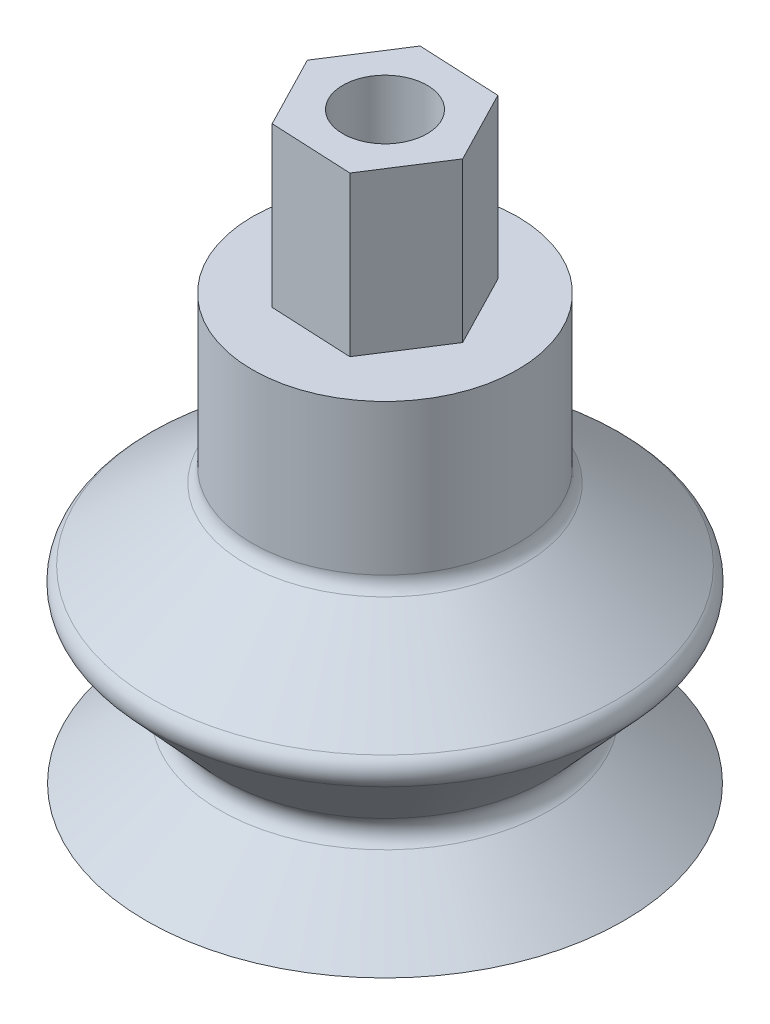
ISO-10303-21;
HEADER;
FILE_DESCRIPTION(('STEP AP214'),'2;1');
FILE_NAME('part.step','',(''),(''),'','','');
FILE_SCHEMA(('AUTOMOTIVE_DESIGN { 1 0 10303 214 1 1 1 1 }'));
ENDSEC;
DATA;
#1=APPLICATION_CONTEXT('core data for automotive mechanical design processes');
#2=APPLICATION_PROTOCOL_DEFINITION('international standard','automotive_design',2000,#1);
#3=PRODUCT_CONTEXT('',#1,'mechanical');
#4=PRODUCT('Part','Part','',(#3));
#5=PRODUCT_RELATED_PRODUCT_CATEGORY('part','',(#4));
#6=PRODUCT_DEFINITION_FORMATION('','',#4);
#7=PRODUCT_DEFINITION_CONTEXT('part definition',#1,'design');
#8=PRODUCT_DEFINITION('design','',#6,#7);
#9=PRODUCT_DEFINITION_SHAPE('','',#8);
#10=(LENGTH_UNIT() NAMED_UNIT(*) SI_UNIT(.MILLI.,.METRE.));
#11=(NAMED_UNIT(*) PLANE_ANGLE_UNIT() SI_UNIT($,.RADIAN.));
#12=(NAMED_UNIT(*) SI_UNIT($,.STERADIAN.) SOLID_ANGLE_UNIT());
#13=UNCERTAINTY_MEASURE_WITH_UNIT(LENGTH_MEASURE(1.E-05),#10,'distance_accuracy_value','');
#14=(GEOMETRIC_REPRESENTATION_CONTEXT(3) GLOBAL_UNCERTAINTY_ASSIGNED_CONTEXT((#13)) GLOBAL_UNIT_ASSIGNED_CONTEXT((#10,
#11,#12)) REPRESENTATION_CONTEXT('',''));
#15=CARTESIAN_POINT('',(0.,0.,0.));
#16=DIRECTION('',(0.,0.,1.));
#17=DIRECTION('',(1.,0.,0.));
#18=AXIS2_PLACEMENT_3D('',#15,#16,#17);
#19=CARTESIAN_POINT('',(7.5,24.,0.));
#20=DIRECTION('',(0.,-1.,0.));
#21=DIRECTION('',(1.,0.,0.));
#22=AXIS2_PLACEMENT_3D('',#19,#20,#21);
#23=PLANE('',#22);
#24=CARTESIAN_POINT('',(0.,24.,0.));
#25=DIRECTION('',(0.,1.,0.));
#26=DIRECTION('',(-1.,0.,0.));
#27=AXIS2_PLACEMENT_3D('',#24,#25,#26);
#28=CIRCLE('',#27,7.5);
#29=CARTESIAN_POINT('',(-7.5,24.,0.));
#30=VERTEX_POINT('',#29);
#31=EDGE_CURVE('E131',#30,#30,#28,.T.);
#32=ORIENTED_EDGE('',*,*,#31,.T.);
#33=EDGE_LOOP('',(#32));
#34=FACE_BOUND('',#33,.T.);
#35=DIRECTION('',(-0.458306437489919,0.,-0.88879424466819));
#36=VECTOR('',#35,1.);
#37=CARTESIAN_POINT('',(4.61359035889733,24.,0.219356635693805));
#38=LINE('',#37,#36);
#39=CARTESIAN_POINT('',(4.61359035889733,24.,0.219356635693805));
#40=VERTEX_POINT('',#39);
#41=CARTESIAN_POINT('',(2.49676359844819,24.,-3.88580813561316));
#42=VERTEX_POINT('',#41);
#43=EDGE_CURVE('E53',#40,#42,#38,.T.);
#44=ORIENTED_EDGE('',*,*,#43,.F.);
#45=DIRECTION('',(0.540565175875095,0.,-0.84130213991831));
#46=VECTOR('',#45,1.);
#47=CARTESIAN_POINT('',(2.11682676044914,24.,4.10516477130696));
#48=LINE('',#47,#46);
#49=CARTESIAN_POINT('',(2.11682676044914,24.,4.10516477130696));
#50=VERTEX_POINT('',#49);
#51=EDGE_CURVE('E57',#50,#40,#48,.T.);
#52=ORIENTED_EDGE('',*,*,#51,.F.);
#53=DIRECTION('',(0.998871613365014,0.,0.0474921047498808));
#54=VECTOR('',#53,1.);
#55=CARTESIAN_POINT('',(-2.49676359844819,24.,3.88580813561316));
#56=LINE('',#55,#54);
#57=CARTESIAN_POINT('',(-2.49676359844819,24.,3.88580813561316));
#58=VERTEX_POINT('',#57);
#59=EDGE_CURVE('E259',#58,#50,#56,.T.);
#60=ORIENTED_EDGE('',*,*,#59,.F.);
#61=DIRECTION('',(0.458306437489919,0.,0.88879424466819));
#62=VECTOR('',#61,1.);
#63=CARTESIAN_POINT('',(-4.61359035889733,24.,-0.219356635693805));
#64=LINE('',#63,#62);
#65=CARTESIAN_POINT('',(-4.61359035889733,24.,-0.219356635693805));
#66=VERTEX_POINT('',#65);
#67=EDGE_CURVE('E256',#66,#58,#64,.T.);
#68=ORIENTED_EDGE('',*,*,#67,.F.);
#69=DIRECTION('',(-0.540565175875095,0.,0.84130213991831));
#70=VECTOR('',#69,1.);
#71=CARTESIAN_POINT('',(-2.11682676044914,24.,-4.10516477130696));
#72=LINE('',#71,#70);
#73=CARTESIAN_POINT('',(-2.11682676044914,24.,-4.10516477130696));
#74=VERTEX_POINT('',#73);
#75=EDGE_CURVE('E253',#74,#66,#72,.T.);
#76=ORIENTED_EDGE('',*,*,#75,.F.);
#77=DIRECTION('',(-0.998871613365014,0.,-0.0474921047498808));
#78=VECTOR('',#77,1.);
#79=CARTESIAN_POINT('',(2.49676359844819,24.,-3.88580813561316));
#80=LINE('',#79,#78);
#81=EDGE_CURVE('E251',#42,#74,#80,.T.);
#82=ORIENTED_EDGE('',*,*,#81,.F.);
#83=EDGE_LOOP('',(#44,#52,#60,#68,#76,#82));
#84=FACE_BOUND('',#83,.T.);
#85=ADVANCED_FACE('F38',(#34,#84),#23,.F.);
#86=CARTESIAN_POINT('',(0.,0.,0.));
#87=DIRECTION('',(0.,1.,0.));
#88=DIRECTION('',(-1.,0.,0.));
#89=AXIS2_PLACEMENT_3D('',#86,#87,#88);
#90=PLANE('',#89);
#91=CARTESIAN_POINT('',(0.,0.,0.));
#92=DIRECTION('',(0.,1.,0.));
#93=DIRECTION('',(-1.,0.,0.));
#94=AXIS2_PLACEMENT_3D('',#91,#92,#93);
#95=CIRCLE('',#94,12.0592970465776);
#96=CARTESIAN_POINT('',(-12.0592970465776,0.,0.));
#97=VERTEX_POINT('',#96);
#98=EDGE_CURVE('E123',#97,#97,#95,.T.);
#99=ORIENTED_EDGE('',*,*,#98,.T.);
#100=EDGE_LOOP('',(#99));
#101=FACE_BOUND('',#100,.T.);
#102=CARTESIAN_POINT('',(0.,0.,0.));
#103=DIRECTION('',(0.,1.,0.));
#104=DIRECTION('',(-1.,0.,0.));
#105=AXIS2_PLACEMENT_3D('',#102,#103,#104);
#106=CIRCLE('',#105,13.5);
#107=CARTESIAN_POINT('',(-13.5,0.,0.));
#108=VERTEX_POINT('',#107);
#109=EDGE_CURVE('E134',#108,#108,#106,.T.);
#110=ORIENTED_EDGE('',*,*,#109,.F.);
#111=EDGE_LOOP('',(#110));
#112=FACE_BOUND('',#111,.T.);
#113=ADVANCED_FACE('F175',(#101,#112),#90,.F.);
#114=CARTESIAN_POINT('',(0.,0.,0.));
#115=DIRECTION('',(0.,-1.,0.));
#116=DIRECTION('',(1.,0.,0.));
#117=AXIS2_PLACEMENT_3D('',#114,#115,#116);
#118=CONICAL_SURFACE('',#117,13.5,0.896055384571344);
#119=CARTESIAN_POINT('',(0.,3.33184473348769,0.));
#120=DIRECTION('',(0.,-1.,0.));
#121=DIRECTION('',(1.,0.,0.));
#122=AXIS2_PLACEMENT_3D('',#119,#120,#121);
#123=CIRCLE('',#122,9.33519408314038);
#124=CARTESIAN_POINT('',(9.33519408314038,3.3318447334877,0.));
#125=VERTEX_POINT('',#124);
#126=EDGE_CURVE('E11',#125,#125,#123,.T.);
#127=ORIENTED_EDGE('',*,*,#126,.T.);
#128=EDGE_LOOP('',(#127));
#129=FACE_BOUND('',#128,.T.);
#130=ORIENTED_EDGE('',*,*,#109,.T.);
#131=EDGE_LOOP('',(#130));
#132=FACE_BOUND('',#131,.T.);
#133=ADVANCED_FACE('F172',(#129,#132),#118,.T.);
#134=CARTESIAN_POINT('',(0.,4.,0.));
#135=DIRECTION('',(0.,1.,0.));
#136=DIRECTION('',(-1.,0.,0.));
#137=AXIS2_PLACEMENT_3D('',#134,#135,#136);
#138=CONICAL_SURFACE('',#137,8.5,0.741947268005917);
#139=CARTESIAN_POINT('',(0.,9.19635647057557,0.));
#140=DIRECTION('',(0.,-1.,0.));
#141=DIRECTION('',(1.,0.,0.));
#142=AXIS2_PLACEMENT_3D('',#139,#140,#141);
#143=CIRCLE('',#142,13.2633267646943);
#144=CARTESIAN_POINT('',(13.2633267646943,9.19635647057557,0.));
#145=VERTEX_POINT('',#144);
#146=EDGE_CURVE('E46',#145,#145,#143,.T.);
#147=ORIENTED_EDGE('',*,*,#146,.T.);
#148=EDGE_LOOP('',(#147));
#149=FACE_BOUND('',#148,.T.);
#150=CARTESIAN_POINT('',(0.,4.78843817144807,0.));
#151=DIRECTION('',(0.,1.,0.));
#152=DIRECTION('',(-1.,0.,0.));
#153=AXIS2_PLACEMENT_3D('',#150,#151,#152);
#154=CIRCLE('',#153,9.22273499049407);
#155=CARTESIAN_POINT('',(-9.22273499049407,4.78843817144807,0.));
#156=VERTEX_POINT('',#155);
#157=EDGE_CURVE('E146',#156,#156,#154,.T.);
#158=ORIENTED_EDGE('',*,*,#157,.T.);
#159=EDGE_LOOP('',(#158));
#160=FACE_BOUND('',#159,.T.);
#161=ADVANCED_FACE('F151',(#149,#160),#138,.T.);
#162=CARTESIAN_POINT('',(0.,10.,0.));
#163=DIRECTION('',(0.,-1.,0.));
#164=DIRECTION('',(1.,0.,0.));
#165=AXIS2_PLACEMENT_3D('',#162,#163,#164);
#166=CONICAL_SURFACE('',#165,14.,0.91510070055336);
#167=CARTESIAN_POINT('',(0.,14.6997775083459,0.));
#168=DIRECTION('',(0.,-1.,0.));
#169=DIRECTION('',(1.,0.,0.));
#170=AXIS2_PLACEMENT_3D('',#167,#168,#169);
#171=CIRCLE('',#170,7.8902892391503);
#172=CARTESIAN_POINT('',(7.8902892391503,14.6997775083459,0.));
#173=VERTEX_POINT('',#172);
#174=EDGE_CURVE('E143',#173,#173,#171,.T.);
#175=ORIENTED_EDGE('',*,*,#174,.T.);
#176=EDGE_LOOP('',(#175));
#177=FACE_BOUND('',#176,.T.);
#178=CARTESIAN_POINT('',(0.,10.6647050881975,0.));
#179=DIRECTION('',(0.,1.,0.));
#180=DIRECTION('',(-1.,0.,0.));
#181=AXIS2_PLACEMENT_3D('',#178,#179,#180);
#182=CIRCLE('',#181,13.1358833853432);
#183=CARTESIAN_POINT('',(-13.1358833853432,10.6647050881975,0.));
#184=VERTEX_POINT('',#183);
#185=EDGE_CURVE('E140',#184,#184,#182,.T.);
#186=ORIENTED_EDGE('',*,*,#185,.T.);
#187=EDGE_LOOP('',(#186));
#188=FACE_BOUND('',#187,.T.);
#189=ADVANCED_FACE('F160',(#177,#188),#166,.T.);
#190=CARTESIAN_POINT('',(0.,24.,0.));
#191=DIRECTION('',(0.,1.,0.));
#192=DIRECTION('',(-1.,0.,0.));
#193=AXIS2_PLACEMENT_3D('',#190,#191,#192);
#194=CYLINDRICAL_SURFACE('',#193,7.5);
#195=CARTESIAN_POINT('',(0.,15.4924014974505,0.));
#196=DIRECTION('',(0.,1.,0.));
#197=DIRECTION('',(-1.,0.,0.));
#198=AXIS2_PLACEMENT_3D('',#195,#196,#197);
#199=CIRCLE('',#198,7.5);
#200=CARTESIAN_POINT('',(-7.5,15.4924014974505,0.));
#201=VERTEX_POINT('',#200);
#202=EDGE_CURVE('E137',#201,#201,#199,.T.);
#203=ORIENTED_EDGE('',*,*,#202,.T.);
#204=EDGE_LOOP('',(#203));
#205=FACE_BOUND('',#204,.T.);
#206=ORIENTED_EDGE('',*,*,#31,.F.);
#207=EDGE_LOOP('',(#206));
#208=FACE_BOUND('',#207,.T.);
#209=ADVANCED_FACE('F162',(#205,#208),#194,.T.);
#210=CARTESIAN_POINT('',(0.,-0.702781928498727,0.));
#211=DIRECTION('',(0.,-1.,0.));
#212=DIRECTION('',(1.,0.,0.));
#213=AXIS2_PLACEMENT_3D('',#210,#211,#212);
#214=CONICAL_SURFACE('',#213,12.937774457201,0.896055384571344);
#215=CARTESIAN_POINT('',(0.,3.89855781136235,0.));
#216=DIRECTION('',(0.,1.,0.));
#217=DIRECTION('',(-1.,0.,0.));
#218=AXIS2_PLACEMENT_3D('',#215,#216,#217);
#219=CIRCLE('',#218,7.18609978237468);
#220=CARTESIAN_POINT('',(-7.18609978237468,3.89855781136235,0.));
#221=VERTEX_POINT('',#220);
#222=EDGE_CURVE('E120',#221,#221,#219,.T.);
#223=ORIENTED_EDGE('',*,*,#222,.T.);
#224=EDGE_LOOP('',(#223));
#225=FACE_BOUND('',#224,.T.);
#226=ORIENTED_EDGE('',*,*,#98,.F.);
#227=EDGE_LOOP('',(#226));
#228=FACE_BOUND('',#227,.T.);
#229=ADVANCED_FACE('F169',(#225,#228),#214,.F.);
#230=CARTESIAN_POINT('',(0.,4.60815216566561,0.));
#231=DIRECTION('',(0.,1.,0.));
#232=DIRECTION('',(-1.,0.,0.));
#233=AXIS2_PLACEMENT_3D('',#230,#231,#232);
#234=CONICAL_SURFACE('',#233,7.83656127381933,0.741947268005917);
#235=CARTESIAN_POINT('',(0.,9.88487298918363,0.));
#236=DIRECTION('',(0.,1.,0.));
#237=DIRECTION('',(-1.,0.,0.));
#238=AXIS2_PLACEMENT_3D('',#235,#236,#237);
#239=CIRCLE('',#238,12.6735553620442);
#240=CARTESIAN_POINT('',(-12.6735553620442,9.88487298918363,0.));
#241=VERTEX_POINT('',#240);
#242=EDGE_CURVE('E124',#241,#241,#239,.T.);
#243=ORIENTED_EDGE('',*,*,#242,.T.);
#244=EDGE_LOOP('',(#243));
#245=FACE_BOUND('',#244,.T.);
#246=ORIENTED_EDGE('',*,*,#222,.F.);
#247=EDGE_LOOP('',(#246));
#248=FACE_BOUND('',#247,.T.);
#249=ADVANCED_FACE('F195',(#245,#248),#234,.F.);
#250=CARTESIAN_POINT('',(0.,9.28663840980586,0.));
#251=DIRECTION('',(0.,-1.,0.));
#252=DIRECTION('',(1.,0.,0.));
#253=AXIS2_PLACEMENT_3D('',#250,#251,#252);
#254=CONICAL_SURFACE('',#253,13.4512603152353,0.91510070055336);
#255=CARTESIAN_POINT('',(0.,14.5568386522945,0.));
#256=DIRECTION('',(0.,-1.,0.));
#257=DIRECTION('',(1.,0.,0.));
#258=AXIS2_PLACEMENT_3D('',#255,#256,#257);
#259=CIRCLE('',#258,6.6);
#260=CARTESIAN_POINT('',(6.6,14.5568386522945,0.));
#261=VERTEX_POINT('',#260);
#262=EDGE_CURVE('E114',#261,#261,#259,.F.);
#263=ORIENTED_EDGE('',*,*,#262,.T.);
#264=EDGE_LOOP('',(#263));
#265=FACE_BOUND('',#264,.T.);
#266=ORIENTED_EDGE('',*,*,#242,.F.);
#267=EDGE_LOOP('',(#266));
#268=FACE_BOUND('',#267,.T.);
#269=ADVANCED_FACE('F191',(#265,#268),#254,.F.);
#270=CARTESIAN_POINT('',(0.,24.,0.));
#271=DIRECTION('',(0.,1.,0.));
#272=DIRECTION('',(-1.,0.,0.));
#273=AXIS2_PLACEMENT_3D('',#270,#271,#272);
#274=CYLINDRICAL_SURFACE('',#273,6.6);
#275=CARTESIAN_POINT('',(0.,23.1,0.));
#276=DIRECTION('',(0.,-1.,0.));
#277=DIRECTION('',(1.,0.,0.));
#278=AXIS2_PLACEMENT_3D('',#275,#276,#277);
#279=CIRCLE('',#278,6.6);
#280=CARTESIAN_POINT('',(6.6,23.1,0.));
#281=VERTEX_POINT('',#280);
#282=EDGE_CURVE('E111',#281,#281,#279,.F.);
#283=ORIENTED_EDGE('',*,*,#282,.T.);
#284=EDGE_LOOP('',(#283));
#285=FACE_BOUND('',#284,.T.);
#286=ORIENTED_EDGE('',*,*,#262,.F.);
#287=EDGE_LOOP('',(#286));
#288=FACE_BOUND('',#287,.T.);
#289=ADVANCED_FACE('F187',(#285,#288),#274,.F.);
#290=CARTESIAN_POINT('',(7.5,23.1,0.));
#291=DIRECTION('',(0.,-1.,0.));
#292=DIRECTION('',(1.,0.,0.));
#293=AXIS2_PLACEMENT_3D('',#290,#291,#292);
#294=PLANE('',#293);
#295=CARTESIAN_POINT('',(0.,23.1,0.));
#296=DIRECTION('',(0.,-1.,0.));
#297=DIRECTION('',(1.,0.,0.));
#298=AXIS2_PLACEMENT_3D('',#295,#296,#297);
#299=CIRCLE('',#298,2.38125);
#300=CARTESIAN_POINT('',(2.38125,23.1,0.));
#301=VERTEX_POINT('',#300);
#302=EDGE_CURVE('E236',#301,#301,#299,.T.);
#303=ORIENTED_EDGE('',*,*,#302,.F.);
#304=EDGE_LOOP('',(#303));
#305=FACE_BOUND('',#304,.T.);
#306=ORIENTED_EDGE('',*,*,#282,.F.);
#307=EDGE_LOOP('',(#306));
#308=FACE_BOUND('',#307,.T.);
#309=ADVANCED_FACE('F184',(#305,#308),#294,.T.);
#310=CARTESIAN_POINT('',(4.61359035889733,33.,0.219356635693805));
#311=DIRECTION('',(-0.88879424466819,0.,0.458306437489919));
#312=DIRECTION('',(0.458306437489919,0.,0.888794244668191));
#313=AXIS2_PLACEMENT_3D('',#310,#311,#312);
#314=PLANE('',#313);
#315=ORIENTED_EDGE('',*,*,#43,.T.);
#316=DIRECTION('',(0.,-1.,0.));
#317=VECTOR('',#316,1.);
#318=CARTESIAN_POINT('',(2.49676359844819,33.,-3.88580813561316));
#319=LINE('',#318,#317);
#320=CARTESIAN_POINT('',(2.49676359844819,33.,-3.88580813561316));
#321=VERTEX_POINT('',#320);
#322=EDGE_CURVE('E94',#321,#42,#319,.T.);
#323=ORIENTED_EDGE('',*,*,#322,.F.);
#324=DIRECTION('',(-0.458306437489919,0.,-0.88879424466819));
#325=VECTOR('',#324,1.);
#326=CARTESIAN_POINT('',(4.61359035889733,33.,0.219356635693805));
#327=LINE('',#326,#325);
#328=CARTESIAN_POINT('',(4.61359035889733,33.,0.219356635693805));
#329=VERTEX_POINT('',#328);
#330=EDGE_CURVE('E100',#329,#321,#327,.T.);
#331=ORIENTED_EDGE('',*,*,#330,.F.);
#332=DIRECTION('',(0.,-1.,0.));
#333=VECTOR('',#332,1.);
#334=CARTESIAN_POINT('',(4.61359035889733,33.,0.219356635693805));
#335=LINE('',#334,#333);
#336=EDGE_CURVE('E249',#329,#40,#335,.T.);
#337=ORIENTED_EDGE('',*,*,#336,.T.);
#338=EDGE_LOOP('',(#315,#323,#331,#337));
#339=FACE_BOUND('',#338,.T.);
#340=ADVANCED_FACE('F110',(#339),#314,.F.);
#341=CARTESIAN_POINT('',(2.49676359844819,33.,-3.88580813561316));
#342=DIRECTION('',(-0.0474921047498808,0.,0.998871613365014));
#343=DIRECTION('',(0.998871613365014,0.,0.0474921047498808));
#344=AXIS2_PLACEMENT_3D('',#341,#342,#343);
#345=PLANE('',#344);
#346=ORIENTED_EDGE('',*,*,#81,.T.);
#347=DIRECTION('',(0.,-1.,0.));
#348=VECTOR('',#347,1.);
#349=CARTESIAN_POINT('',(-2.11682676044914,33.,-4.10516477130696));
#350=LINE('',#349,#348);
#351=CARTESIAN_POINT('',(-2.11682676044914,33.,-4.10516477130696));
#352=VERTEX_POINT('',#351);
#353=EDGE_CURVE('E96',#352,#74,#350,.T.);
#354=ORIENTED_EDGE('',*,*,#353,.F.);
#355=DIRECTION('',(-0.998871613365014,0.,-0.0474921047498808));
#356=VECTOR('',#355,1.);
#357=CARTESIAN_POINT('',(2.49676359844819,33.,-3.88580813561316));
#358=LINE('',#357,#356);
#359=EDGE_CURVE('E89',#321,#352,#358,.T.);
#360=ORIENTED_EDGE('',*,*,#359,.F.);
#361=ORIENTED_EDGE('',*,*,#322,.T.);
#362=EDGE_LOOP('',(#346,#354,#360,#361));
#363=FACE_BOUND('',#362,.T.);
#364=ADVANCED_FACE('F92',(#363),#345,.F.);
#365=CARTESIAN_POINT('',(-2.11682676044914,33.,-4.10516477130696));
#366=DIRECTION('',(0.84130213991831,0.,0.540565175875095));
#367=DIRECTION('',(0.540565175875095,0.,-0.84130213991831));
#368=AXIS2_PLACEMENT_3D('',#365,#366,#367);
#369=PLANE('',#368);
#370=ORIENTED_EDGE('',*,*,#75,.T.);
#371=DIRECTION('',(0.,-1.,0.));
#372=VECTOR('',#371,1.);
#373=CARTESIAN_POINT('',(-4.61359035889733,33.,-0.219356635693805));
#374=LINE('',#373,#372);
#375=CARTESIAN_POINT('',(-4.61359035889733,33.,-0.219356635693805));
#376=VERTEX_POINT('',#375);
#377=EDGE_CURVE('E116',#376,#66,#374,.T.);
#378=ORIENTED_EDGE('',*,*,#377,.F.);
#379=DIRECTION('',(-0.540565175875095,0.,0.84130213991831));
#380=VECTOR('',#379,1.);
#381=CARTESIAN_POINT('',(-2.11682676044914,33.,-4.10516477130696));
#382=LINE('',#381,#380);
#383=EDGE_CURVE('E99',#352,#376,#382,.T.);
#384=ORIENTED_EDGE('',*,*,#383,.F.);
#385=ORIENTED_EDGE('',*,*,#353,.T.);
#386=EDGE_LOOP('',(#370,#378,#384,#385));
#387=FACE_BOUND('',#386,.T.);
#388=ADVANCED_FACE('F207',(#387),#369,.F.);
#389=CARTESIAN_POINT('',(-4.61359035889733,33.,-0.219356635693805));
#390=DIRECTION('',(0.88879424466819,0.,-0.458306437489919));
#391=DIRECTION('',(-0.458306437489919,0.,-0.888794244668191));
#392=AXIS2_PLACEMENT_3D('',#389,#390,#391);
#393=PLANE('',#392);
#394=ORIENTED_EDGE('',*,*,#67,.T.);
#395=DIRECTION('',(0.,-1.,0.));
#396=VECTOR('',#395,1.);
#397=CARTESIAN_POINT('',(-2.49676359844819,33.,3.88580813561316));
#398=LINE('',#397,#396);
#399=CARTESIAN_POINT('',(-2.49676359844819,33.,3.88580813561316));
#400=VERTEX_POINT('',#399);
#401=EDGE_CURVE('E266',#400,#58,#398,.T.);
#402=ORIENTED_EDGE('',*,*,#401,.F.);
#403=DIRECTION('',(0.458306437489919,0.,0.88879424466819));
#404=VECTOR('',#403,1.);
#405=CARTESIAN_POINT('',(-4.61359035889733,33.,-0.219356635693805));
#406=LINE('',#405,#404);
#407=EDGE_CURVE('E244',#376,#400,#406,.T.);
#408=ORIENTED_EDGE('',*,*,#407,.F.);
#409=ORIENTED_EDGE('',*,*,#377,.T.);
#410=EDGE_LOOP('',(#394,#402,#408,#409));
#411=FACE_BOUND('',#410,.T.);
#412=ADVANCED_FACE('F210',(#411),#393,.F.);
#413=CARTESIAN_POINT('',(-2.49676359844819,33.,3.88580813561316));
#414=DIRECTION('',(0.0474921047498808,0.,-0.998871613365014));
#415=DIRECTION('',(-0.998871613365014,0.,-0.0474921047498808));
#416=AXIS2_PLACEMENT_3D('',#413,#414,#415);
#417=PLANE('',#416);
#418=ORIENTED_EDGE('',*,*,#59,.T.);
#419=DIRECTION('',(0.,-1.,0.));
#420=VECTOR('',#419,1.);
#421=CARTESIAN_POINT('',(2.11682676044914,33.,4.10516477130696));
#422=LINE('',#421,#420);
#423=CARTESIAN_POINT('',(2.11682676044914,33.,4.10516477130696));
#424=VERTEX_POINT('',#423);
#425=EDGE_CURVE('E263',#424,#50,#422,.T.);
#426=ORIENTED_EDGE('',*,*,#425,.F.);
#427=DIRECTION('',(0.998871613365014,0.,0.0474921047498808));
#428=VECTOR('',#427,1.);
#429=CARTESIAN_POINT('',(-2.49676359844819,33.,3.88580813561316));
#430=LINE('',#429,#428);
#431=EDGE_CURVE('E246',#400,#424,#430,.T.);
#432=ORIENTED_EDGE('',*,*,#431,.F.);
#433=ORIENTED_EDGE('',*,*,#401,.T.);
#434=EDGE_LOOP('',(#418,#426,#432,#433));
#435=FACE_BOUND('',#434,.T.);
#436=ADVANCED_FACE('F214',(#435),#417,.F.);
#437=CARTESIAN_POINT('',(2.11682676044914,33.,4.10516477130696));
#438=DIRECTION('',(-0.84130213991831,0.,-0.540565175875095));
#439=DIRECTION('',(-0.540565175875095,0.,0.84130213991831));
#440=AXIS2_PLACEMENT_3D('',#437,#438,#439);
#441=PLANE('',#440);
#442=ORIENTED_EDGE('',*,*,#51,.T.);
#443=ORIENTED_EDGE('',*,*,#336,.F.);
#444=DIRECTION('',(0.540565175875095,0.,-0.84130213991831));
#445=VECTOR('',#444,1.);
#446=CARTESIAN_POINT('',(2.11682676044914,33.,4.10516477130696));
#447=LINE('',#446,#445);
#448=EDGE_CURVE('E105',#424,#329,#447,.T.);
#449=ORIENTED_EDGE('',*,*,#448,.F.);
#450=ORIENTED_EDGE('',*,*,#425,.T.);
#451=EDGE_LOOP('',(#442,#443,#449,#450));
#452=FACE_BOUND('',#451,.T.);
#453=ADVANCED_FACE('F218',(#452),#441,.F.);
#454=CARTESIAN_POINT('',(0.,33.,0.));
#455=DIRECTION('',(0.,1.,0.));
#456=DIRECTION('',(0.,0.,1.));
#457=AXIS2_PLACEMENT_3D('',#454,#455,#456);
#458=PLANE('',#457);
#459=CARTESIAN_POINT('',(0.,33.,0.));
#460=DIRECTION('',(0.,1.,0.));
#461=DIRECTION('',(0.,0.,1.));
#462=AXIS2_PLACEMENT_3D('',#459,#460,#461);
#463=CIRCLE('',#462,2.38125);
#464=CARTESIAN_POINT('',(0.,33.,2.38125));
#465=VERTEX_POINT('',#464);
#466=EDGE_CURVE('E239',#465,#465,#463,.T.);
#467=ORIENTED_EDGE('',*,*,#466,.F.);
#468=EDGE_LOOP('',(#467));
#469=FACE_BOUND('',#468,.T.);
#470=ORIENTED_EDGE('',*,*,#330,.T.);
#471=ORIENTED_EDGE('',*,*,#359,.T.);
#472=ORIENTED_EDGE('',*,*,#383,.T.);
#473=ORIENTED_EDGE('',*,*,#407,.T.);
#474=ORIENTED_EDGE('',*,*,#431,.T.);
#475=ORIENTED_EDGE('',*,*,#448,.T.);
#476=EDGE_LOOP('',(#470,#471,#472,#473,#474,#475));
#477=FACE_BOUND('',#476,.T.);
#478=ADVANCED_FACE('F103',(#469,#477),#458,.T.);
#479=CARTESIAN_POINT('',(0.,15.4924014974505,0.));
#480=DIRECTION('',(0.,1.,0.));
#481=DIRECTION('',(-1.,0.,0.));
#482=AXIS2_PLACEMENT_3D('',#479,#480,#481);
#483=TOROIDAL_SURFACE('',#482,8.5,1.);
#484=ORIENTED_EDGE('',*,*,#174,.F.);
#485=EDGE_LOOP('',(#484));
#486=FACE_BOUND('',#485,.T.);
#487=ORIENTED_EDGE('',*,*,#202,.F.);
#488=EDGE_LOOP('',(#487));
#489=FACE_BOUND('',#488,.T.);
#490=ADVANCED_FACE('F157',(#486,#489),#483,.F.);
#491=CARTESIAN_POINT('',(0.,9.87208109909292,0.));
#492=DIRECTION('',(0.,-1.,0.));
#493=DIRECTION('',(1.,0.,0.));
#494=AXIS2_PLACEMENT_3D('',#491,#492,#493);
#495=TOROIDAL_SURFACE('',#494,12.5261726244935,1.);
#496=ORIENTED_EDGE('',*,*,#146,.F.);
#497=EDGE_LOOP('',(#496));
#498=FACE_BOUND('',#497,.T.);
#499=ORIENTED_EDGE('',*,*,#185,.F.);
#500=EDGE_LOOP('',(#499));
#501=FACE_BOUND('',#500,.T.);
#502=ADVANCED_FACE('F154',(#498,#501),#495,.T.);
#503=CARTESIAN_POINT('',(0.,4.11271354293073,0.));
#504=DIRECTION('',(0.,1.,0.));
#505=DIRECTION('',(-1.,0.,0.));
#506=AXIS2_PLACEMENT_3D('',#503,#504,#505);
#507=TOROIDAL_SURFACE('',#506,9.95988913069481,1.);
#508=ORIENTED_EDGE('',*,*,#126,.F.);
#509=EDGE_LOOP('',(#508));
#510=FACE_BOUND('',#509,.T.);
#511=ORIENTED_EDGE('',*,*,#157,.F.);
#512=EDGE_LOOP('',(#511));
#513=FACE_BOUND('',#512,.T.);
#514=ADVANCED_FACE('F40',(#510,#513),#507,.F.);
#515=CARTESIAN_POINT('',(0.,0.,0.));
#516=DIRECTION('',(0.,1.,0.));
#517=DIRECTION('',(0.,0.,1.));
#518=AXIS2_PLACEMENT_3D('',#515,#516,#517);
#519=CYLINDRICAL_SURFACE('',#518,2.38125);
#520=ORIENTED_EDGE('',*,*,#302,.T.);
#521=EDGE_LOOP('',(#520));
#522=FACE_BOUND('',#521,.T.);
#523=ORIENTED_EDGE('',*,*,#466,.T.);
#524=EDGE_LOOP('',(#523));
#525=FACE_BOUND('',#524,.T.);
#526=ADVANCED_FACE('F226',(#522,#525),#519,.F.);
#527=CLOSED_SHELL('',(#85,#113,#133,#161,#189,#209,#229,#249,#269,#289,#309,#340,#364,#388,#412,
#436,#453,#478,#490,#502,#514,#526));
#528=MANIFOLD_SOLID_BREP('B2',#527);
#529=ADVANCED_BREP_SHAPE_REPRESENTATION('',(#18,#528),#14);
#530=SHAPE_DEFINITION_REPRESENTATION(#9,#529);
ENDSEC;
END-ISO-10303-21;
